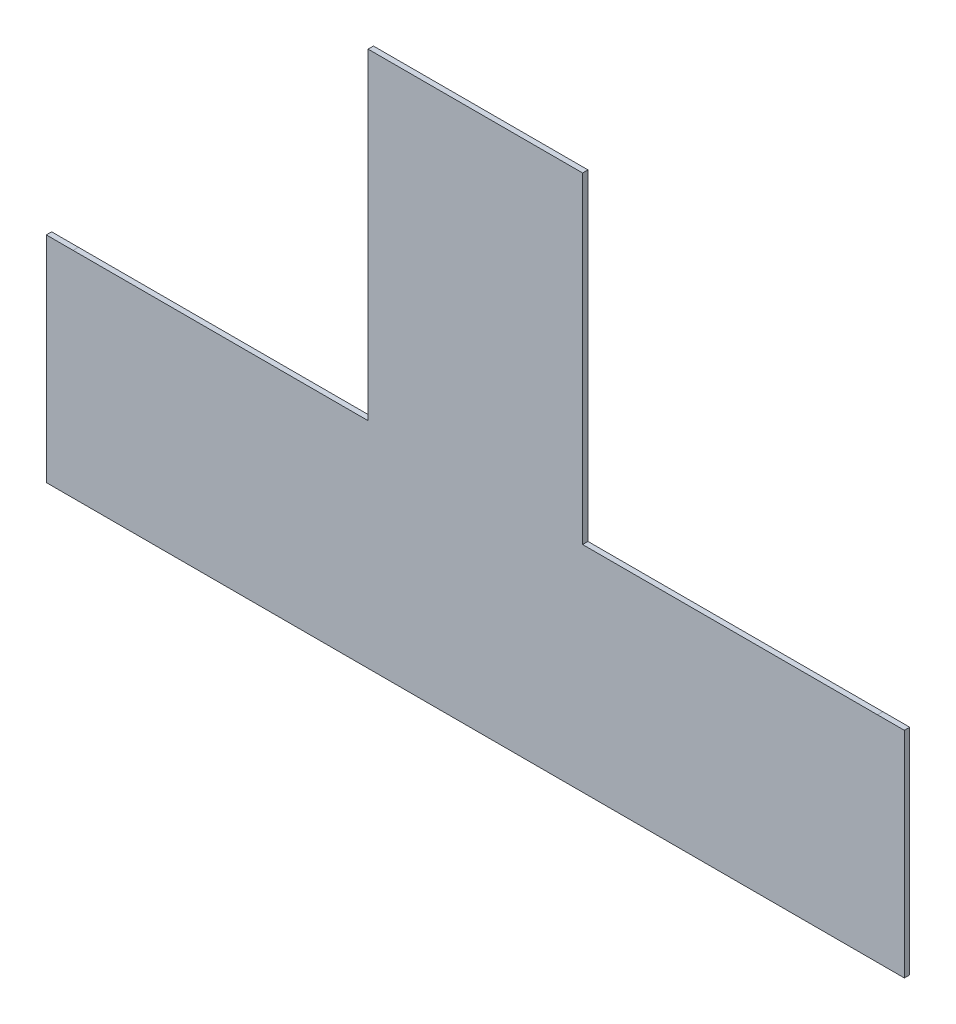
ISO-10303-21;
HEADER;
FILE_DESCRIPTION(('STEP AP214'),'2;1');
FILE_NAME('part.step','',(''),(''),'','','');
FILE_SCHEMA(('AUTOMOTIVE_DESIGN { 1 0 10303 214 1 1 1 1 }'));
ENDSEC;
DATA;
#1=APPLICATION_CONTEXT('core data for automotive mechanical design processes');
#2=APPLICATION_PROTOCOL_DEFINITION('international standard','automotive_design',2000,#1);
#3=PRODUCT_CONTEXT('',#1,'mechanical');
#4=PRODUCT('Part','Part','',(#3));
#5=PRODUCT_RELATED_PRODUCT_CATEGORY('part','',(#4));
#6=PRODUCT_DEFINITION_FORMATION('','',#4);
#7=PRODUCT_DEFINITION_CONTEXT('part definition',#1,'design');
#8=PRODUCT_DEFINITION('design','',#6,#7);
#9=PRODUCT_DEFINITION_SHAPE('','',#8);
#10=(LENGTH_UNIT() NAMED_UNIT(*) SI_UNIT(.MILLI.,.METRE.));
#11=(NAMED_UNIT(*) PLANE_ANGLE_UNIT() SI_UNIT($,.RADIAN.));
#12=(NAMED_UNIT(*) SI_UNIT($,.STERADIAN.) SOLID_ANGLE_UNIT());
#13=UNCERTAINTY_MEASURE_WITH_UNIT(LENGTH_MEASURE(1.E-05),#10,'distance_accuracy_value','');
#14=(GEOMETRIC_REPRESENTATION_CONTEXT(3) GLOBAL_UNCERTAINTY_ASSIGNED_CONTEXT((#13)) GLOBAL_UNIT_ASSIGNED_CONTEXT((#10,
#11,#12)) REPRESENTATION_CONTEXT('',''));
#15=CARTESIAN_POINT('',(0.,0.,0.));
#16=DIRECTION('',(0.,0.,1.));
#17=DIRECTION('',(1.,0.,0.));
#18=AXIS2_PLACEMENT_3D('',#15,#16,#17);
#19=CARTESIAN_POINT('',(0.,400.,10.));
#20=DIRECTION('',(0.,1.,0.));
#21=DIRECTION('',(0.,0.,1.));
#22=AXIS2_PLACEMENT_3D('',#19,#20,#21);
#23=PLANE('',#22);
#24=DIRECTION('',(1.,0.,0.));
#25=VECTOR('',#24,1.);
#26=CARTESIAN_POINT('',(0.,400.,0.));
#27=LINE('',#26,#25);
#28=CARTESIAN_POINT('',(50.0000000000001,400.,0.));
#29=VERTEX_POINT('',#28);
#30=CARTESIAN_POINT('',(600.,400.,0.));
#31=VERTEX_POINT('',#30);
#32=EDGE_CURVE('E165',#29,#31,#27,.T.);
#33=ORIENTED_EDGE('',*,*,#32,.F.);
#34=DIRECTION('',(0.,0.,1.));
#35=VECTOR('',#34,1.);
#36=CARTESIAN_POINT('',(50.,400.,10.));
#37=LINE('',#36,#35);
#38=CARTESIAN_POINT('',(50.,400.,10.));
#39=VERTEX_POINT('',#38);
#40=EDGE_CURVE('E11',#29,#39,#37,.T.);
#41=ORIENTED_EDGE('',*,*,#40,.T.);
#42=DIRECTION('',(1.,0.,0.));
#43=VECTOR('',#42,1.);
#44=CARTESIAN_POINT('',(0.,400.,10.));
#45=LINE('',#44,#43);
#46=CARTESIAN_POINT('',(600.,400.,10.));
#47=VERTEX_POINT('',#46);
#48=EDGE_CURVE('E144',#39,#47,#45,.T.);
#49=ORIENTED_EDGE('',*,*,#48,.T.);
#50=DIRECTION('',(0.,0.,-1.));
#51=VECTOR('',#50,1.);
#52=CARTESIAN_POINT('',(600.,400.,10.));
#53=LINE('',#52,#51);
#54=EDGE_CURVE('E130',#47,#31,#53,.T.);
#55=ORIENTED_EDGE('',*,*,#54,.T.);
#56=EDGE_LOOP('',(#33,#41,#49,#55));
#57=FACE_BOUND('',#56,.T.);
#58=ADVANCED_FACE('F46',(#57),#23,.T.);
#59=CARTESIAN_POINT('',(-1.11022302462516E-13,400.,10.));
#60=DIRECTION('',(0.,-1.,0.));
#61=DIRECTION('',(1.,0.,0.));
#62=AXIS2_PLACEMENT_3D('',#59,#60,#61);
#63=PLANE('',#62);
#64=DIRECTION('',(0.,0.,1.));
#65=VECTOR('',#64,1.);
#66=CARTESIAN_POINT('',(1550.,400.,10.));
#67=LINE('',#66,#65);
#68=CARTESIAN_POINT('',(1550.,400.,0.));
#69=VERTEX_POINT('',#68);
#70=CARTESIAN_POINT('',(1550.,400.,10.));
#71=VERTEX_POINT('',#70);
#72=EDGE_CURVE('E55',#69,#71,#67,.T.);
#73=ORIENTED_EDGE('',*,*,#72,.F.);
#74=DIRECTION('',(-1.,0.,0.));
#75=VECTOR('',#74,1.);
#76=CARTESIAN_POINT('',(-1.11022302462516E-13,400.,0.));
#77=LINE('',#76,#75);
#78=CARTESIAN_POINT('',(1000.,400.,0.));
#79=VERTEX_POINT('',#78);
#80=EDGE_CURVE('E176',#69,#79,#77,.T.);
#81=ORIENTED_EDGE('',*,*,#80,.T.);
#82=DIRECTION('',(0.,0.,-1.));
#83=VECTOR('',#82,1.);
#84=CARTESIAN_POINT('',(1000.,400.,10.));
#85=LINE('',#84,#83);
#86=CARTESIAN_POINT('',(1000.,400.,10.));
#87=VERTEX_POINT('',#86);
#88=EDGE_CURVE('E183',#87,#79,#85,.T.);
#89=ORIENTED_EDGE('',*,*,#88,.F.);
#90=DIRECTION('',(-1.,0.,0.));
#91=VECTOR('',#90,1.);
#92=CARTESIAN_POINT('',(-1.11022302462516E-13,400.,10.));
#93=LINE('',#92,#91);
#94=EDGE_CURVE('E156',#71,#87,#93,.T.);
#95=ORIENTED_EDGE('',*,*,#94,.F.);
#96=EDGE_LOOP('',(#73,#81,#89,#95));
#97=FACE_BOUND('',#96,.T.);
#98=ADVANCED_FACE('F207',(#97),#63,.F.);
#99=CARTESIAN_POINT('',(0.,1000.,10.));
#100=DIRECTION('',(0.,1.,0.));
#101=DIRECTION('',(0.,0.,1.));
#102=AXIS2_PLACEMENT_3D('',#99,#100,#101);
#103=PLANE('',#102);
#104=DIRECTION('',(1.,0.,0.));
#105=VECTOR('',#104,1.);
#106=CARTESIAN_POINT('',(0.,1000.,0.));
#107=LINE('',#106,#105);
#108=CARTESIAN_POINT('',(600.,1000.,0.));
#109=VERTEX_POINT('',#108);
#110=CARTESIAN_POINT('',(1000.,1000.,0.));
#111=VERTEX_POINT('',#110);
#112=EDGE_CURVE('E125',#109,#111,#107,.T.);
#113=ORIENTED_EDGE('',*,*,#112,.F.);
#114=DIRECTION('',(0.,0.,-1.));
#115=VECTOR('',#114,1.);
#116=CARTESIAN_POINT('',(600.,1000.,10.));
#117=LINE('',#116,#115);
#118=CARTESIAN_POINT('',(600.,1000.,10.));
#119=VERTEX_POINT('',#118);
#120=EDGE_CURVE('E121',#119,#109,#117,.T.);
#121=ORIENTED_EDGE('',*,*,#120,.F.);
#122=DIRECTION('',(1.,0.,0.));
#123=VECTOR('',#122,1.);
#124=CARTESIAN_POINT('',(0.,1000.,10.));
#125=LINE('',#124,#123);
#126=CARTESIAN_POINT('',(1000.,1000.,10.));
#127=VERTEX_POINT('',#126);
#128=EDGE_CURVE('E123',#119,#127,#125,.T.);
#129=ORIENTED_EDGE('',*,*,#128,.T.);
#130=DIRECTION('',(0.,0.,-1.));
#131=VECTOR('',#130,1.);
#132=CARTESIAN_POINT('',(1000.,1000.,10.));
#133=LINE('',#132,#131);
#134=EDGE_CURVE('E161',#127,#111,#133,.T.);
#135=ORIENTED_EDGE('',*,*,#134,.T.);
#136=EDGE_LOOP('',(#113,#121,#129,#135));
#137=FACE_BOUND('',#136,.T.);
#138=ADVANCED_FACE('F48',(#137),#103,.T.);
#139=CARTESIAN_POINT('',(600.,0.,10.));
#140=DIRECTION('',(-1.,0.,0.));
#141=DIRECTION('',(0.,0.,1.));
#142=AXIS2_PLACEMENT_3D('',#139,#140,#141);
#143=PLANE('',#142);
#144=DIRECTION('',(0.,1.,0.));
#145=VECTOR('',#144,1.);
#146=CARTESIAN_POINT('',(600.,0.,0.));
#147=LINE('',#146,#145);
#148=EDGE_CURVE('E163',#31,#109,#147,.T.);
#149=ORIENTED_EDGE('',*,*,#148,.F.);
#150=ORIENTED_EDGE('',*,*,#54,.F.);
#151=DIRECTION('',(0.,1.,0.));
#152=VECTOR('',#151,1.);
#153=CARTESIAN_POINT('',(600.,0.,10.));
#154=LINE('',#153,#152);
#155=EDGE_CURVE('E135',#47,#119,#154,.T.);
#156=ORIENTED_EDGE('',*,*,#155,.T.);
#157=ORIENTED_EDGE('',*,*,#120,.T.);
#158=EDGE_LOOP('',(#149,#150,#156,#157));
#159=FACE_BOUND('',#158,.T.);
#160=ADVANCED_FACE('F142',(#159),#143,.T.);
#161=ORIENTED_EDGE('',*,*,#40,.F.);
#162=CARTESIAN_POINT('',(0.,400.,0.));
#163=VERTEX_POINT('',#162);
#164=EDGE_CURVE('E166',#163,#29,#27,.T.);
#165=ORIENTED_EDGE('',*,*,#164,.F.);
#166=DIRECTION('',(0.,0.,-1.));
#167=VECTOR('',#166,1.);
#168=CARTESIAN_POINT('',(0.,400.,10.));
#169=LINE('',#168,#167);
#170=CARTESIAN_POINT('',(0.,400.,10.));
#171=VERTEX_POINT('',#170);
#172=EDGE_CURVE('E194',#171,#163,#169,.T.);
#173=ORIENTED_EDGE('',*,*,#172,.F.);
#174=EDGE_CURVE('E146',#171,#39,#45,.T.);
#175=ORIENTED_EDGE('',*,*,#174,.T.);
#176=EDGE_LOOP('',(#161,#165,#173,#175));
#177=FACE_BOUND('',#176,.T.);
#178=ADVANCED_FACE('F223',(#177),#23,.T.);
#179=CARTESIAN_POINT('',(0.,0.,10.));
#180=DIRECTION('',(-1.,0.,0.));
#181=DIRECTION('',(0.,0.,1.));
#182=AXIS2_PLACEMENT_3D('',#179,#180,#181);
#183=PLANE('',#182);
#184=DIRECTION('',(0.,1.,0.));
#185=VECTOR('',#184,1.);
#186=CARTESIAN_POINT('',(0.,0.,0.));
#187=LINE('',#186,#185);
#188=CARTESIAN_POINT('',(0.,0.,0.));
#189=VERTEX_POINT('',#188);
#190=EDGE_CURVE('E169',#189,#163,#187,.T.);
#191=ORIENTED_EDGE('',*,*,#190,.F.);
#192=DIRECTION('',(0.,0.,-1.));
#193=VECTOR('',#192,1.);
#194=CARTESIAN_POINT('',(0.,0.,10.));
#195=LINE('',#194,#193);
#196=CARTESIAN_POINT('',(0.,0.,10.));
#197=VERTEX_POINT('',#196);
#198=EDGE_CURVE('E192',#197,#189,#195,.T.);
#199=ORIENTED_EDGE('',*,*,#198,.F.);
#200=DIRECTION('',(0.,1.,0.));
#201=VECTOR('',#200,1.);
#202=CARTESIAN_POINT('',(0.,0.,10.));
#203=LINE('',#202,#201);
#204=EDGE_CURVE('E149',#197,#171,#203,.T.);
#205=ORIENTED_EDGE('',*,*,#204,.T.);
#206=ORIENTED_EDGE('',*,*,#172,.T.);
#207=EDGE_LOOP('',(#191,#199,#205,#206));
#208=FACE_BOUND('',#207,.T.);
#209=ADVANCED_FACE('F226',(#208),#183,.T.);
#210=CARTESIAN_POINT('',(0.,0.,10.));
#211=DIRECTION('',(0.,1.,0.));
#212=DIRECTION('',(-1.,0.,0.));
#213=AXIS2_PLACEMENT_3D('',#210,#211,#212);
#214=PLANE('',#213);
#215=DIRECTION('',(1.,0.,0.));
#216=VECTOR('',#215,1.);
#217=CARTESIAN_POINT('',(0.,0.,0.));
#218=LINE('',#217,#216);
#219=CARTESIAN_POINT('',(1600.,1.95943487863577E-13,0.));
#220=VERTEX_POINT('',#219);
#221=EDGE_CURVE('E172',#189,#220,#218,.T.);
#222=ORIENTED_EDGE('',*,*,#221,.T.);
#223=DIRECTION('',(0.,0.,-1.));
#224=VECTOR('',#223,1.);
#225=CARTESIAN_POINT('',(1600.,1.95943487863577E-13,10.));
#226=LINE('',#225,#224);
#227=CARTESIAN_POINT('',(1600.,1.95943487863577E-13,10.));
#228=VERTEX_POINT('',#227);
#229=EDGE_CURVE('E189',#228,#220,#226,.T.);
#230=ORIENTED_EDGE('',*,*,#229,.F.);
#231=DIRECTION('',(1.,0.,0.));
#232=VECTOR('',#231,1.);
#233=CARTESIAN_POINT('',(0.,0.,10.));
#234=LINE('',#233,#232);
#235=EDGE_CURVE('E152',#197,#228,#234,.T.);
#236=ORIENTED_EDGE('',*,*,#235,.F.);
#237=ORIENTED_EDGE('',*,*,#198,.T.);
#238=EDGE_LOOP('',(#222,#230,#236,#237));
#239=FACE_BOUND('',#238,.T.);
#240=ADVANCED_FACE('F228',(#239),#214,.F.);
#241=CARTESIAN_POINT('',(1600.,0.,10.));
#242=DIRECTION('',(-1.,0.,0.));
#243=DIRECTION('',(0.,0.,1.));
#244=AXIS2_PLACEMENT_3D('',#241,#242,#243);
#245=PLANE('',#244);
#246=DIRECTION('',(0.,1.,0.));
#247=VECTOR('',#246,1.);
#248=CARTESIAN_POINT('',(1600.,0.,0.));
#249=LINE('',#248,#247);
#250=CARTESIAN_POINT('',(1600.,400.,0.));
#251=VERTEX_POINT('',#250);
#252=EDGE_CURVE('E174',#220,#251,#249,.T.);
#253=ORIENTED_EDGE('',*,*,#252,.T.);
#254=DIRECTION('',(0.,0.,-1.));
#255=VECTOR('',#254,1.);
#256=CARTESIAN_POINT('',(1600.,400.,10.));
#257=LINE('',#256,#255);
#258=CARTESIAN_POINT('',(1600.,400.,10.));
#259=VERTEX_POINT('',#258);
#260=EDGE_CURVE('E186',#259,#251,#257,.T.);
#261=ORIENTED_EDGE('',*,*,#260,.F.);
#262=DIRECTION('',(0.,1.,0.));
#263=VECTOR('',#262,1.);
#264=CARTESIAN_POINT('',(1600.,0.,10.));
#265=LINE('',#264,#263);
#266=EDGE_CURVE('E154',#228,#259,#265,.T.);
#267=ORIENTED_EDGE('',*,*,#266,.F.);
#268=ORIENTED_EDGE('',*,*,#229,.T.);
#269=EDGE_LOOP('',(#253,#261,#267,#268));
#270=FACE_BOUND('',#269,.T.);
#271=ADVANCED_FACE('F214',(#270),#245,.F.);
#272=EDGE_CURVE('E177',#251,#69,#77,.T.);
#273=ORIENTED_EDGE('',*,*,#272,.T.);
#274=ORIENTED_EDGE('',*,*,#72,.T.);
#275=EDGE_CURVE('E157',#259,#71,#93,.T.);
#276=ORIENTED_EDGE('',*,*,#275,.F.);
#277=ORIENTED_EDGE('',*,*,#260,.T.);
#278=EDGE_LOOP('',(#273,#274,#276,#277));
#279=FACE_BOUND('',#278,.T.);
#280=ADVANCED_FACE('F202',(#279),#63,.F.);
#281=CARTESIAN_POINT('',(1000.,3.70074341541719E-13,10.));
#282=DIRECTION('',(-1.,0.,0.));
#283=DIRECTION('',(0.,-1.,0.));
#284=AXIS2_PLACEMENT_3D('',#281,#282,#283);
#285=PLANE('',#284);
#286=DIRECTION('',(0.,1.,0.));
#287=VECTOR('',#286,1.);
#288=CARTESIAN_POINT('',(1000.,3.70074341541719E-13,0.));
#289=LINE('',#288,#287);
#290=EDGE_CURVE('E139',#79,#111,#289,.T.);
#291=ORIENTED_EDGE('',*,*,#290,.T.);
#292=ORIENTED_EDGE('',*,*,#134,.F.);
#293=DIRECTION('',(0.,1.,0.));
#294=VECTOR('',#293,1.);
#295=CARTESIAN_POINT('',(1000.,3.70074341541719E-13,10.));
#296=LINE('',#295,#294);
#297=EDGE_CURVE('E137',#87,#127,#296,.T.);
#298=ORIENTED_EDGE('',*,*,#297,.F.);
#299=ORIENTED_EDGE('',*,*,#88,.T.);
#300=EDGE_LOOP('',(#291,#292,#298,#299));
#301=FACE_BOUND('',#300,.T.);
#302=ADVANCED_FACE('F221',(#301),#285,.F.);
#303=CARTESIAN_POINT('',(0.,0.,10.));
#304=DIRECTION('',(0.,0.,1.));
#305=DIRECTION('',(1.,0.,0.));
#306=AXIS2_PLACEMENT_3D('',#303,#304,#305);
#307=PLANE('',#306);
#308=ORIENTED_EDGE('',*,*,#128,.F.);
#309=ORIENTED_EDGE('',*,*,#155,.F.);
#310=ORIENTED_EDGE('',*,*,#48,.F.);
#311=ORIENTED_EDGE('',*,*,#174,.F.);
#312=ORIENTED_EDGE('',*,*,#204,.F.);
#313=ORIENTED_EDGE('',*,*,#235,.T.);
#314=ORIENTED_EDGE('',*,*,#266,.T.);
#315=ORIENTED_EDGE('',*,*,#275,.T.);
#316=ORIENTED_EDGE('',*,*,#94,.T.);
#317=ORIENTED_EDGE('',*,*,#297,.T.);
#318=EDGE_LOOP('',(#308,#309,#310,#311,#312,#313,#314,#315,#316,#317));
#319=FACE_BOUND('',#318,.T.);
#320=ADVANCED_FACE('F134',(#319),#307,.T.);
#321=CARTESIAN_POINT('',(0.,0.,0.));
#322=DIRECTION('',(0.,0.,1.));
#323=DIRECTION('',(1.,0.,0.));
#324=AXIS2_PLACEMENT_3D('',#321,#322,#323);
#325=PLANE('',#324);
#326=ORIENTED_EDGE('',*,*,#112,.T.);
#327=ORIENTED_EDGE('',*,*,#290,.F.);
#328=ORIENTED_EDGE('',*,*,#80,.F.);
#329=ORIENTED_EDGE('',*,*,#272,.F.);
#330=ORIENTED_EDGE('',*,*,#252,.F.);
#331=ORIENTED_EDGE('',*,*,#221,.F.);
#332=ORIENTED_EDGE('',*,*,#190,.T.);
#333=ORIENTED_EDGE('',*,*,#164,.T.);
#334=ORIENTED_EDGE('',*,*,#32,.T.);
#335=ORIENTED_EDGE('',*,*,#148,.T.);
#336=EDGE_LOOP('',(#326,#327,#328,#329,#330,#331,#332,#333,#334,#335));
#337=FACE_BOUND('',#336,.T.);
#338=ADVANCED_FACE('F217',(#337),#325,.F.);
#339=CLOSED_SHELL('',(#58,#98,#138,#160,#178,#209,#240,#271,#280,#302,#320,#338));
#340=MANIFOLD_SOLID_BREP('B2',#339);
#341=ADVANCED_BREP_SHAPE_REPRESENTATION('',(#18,#340),#14);
#342=SHAPE_DEFINITION_REPRESENTATION(#9,#341);
ENDSEC;
END-ISO-10303-21;
